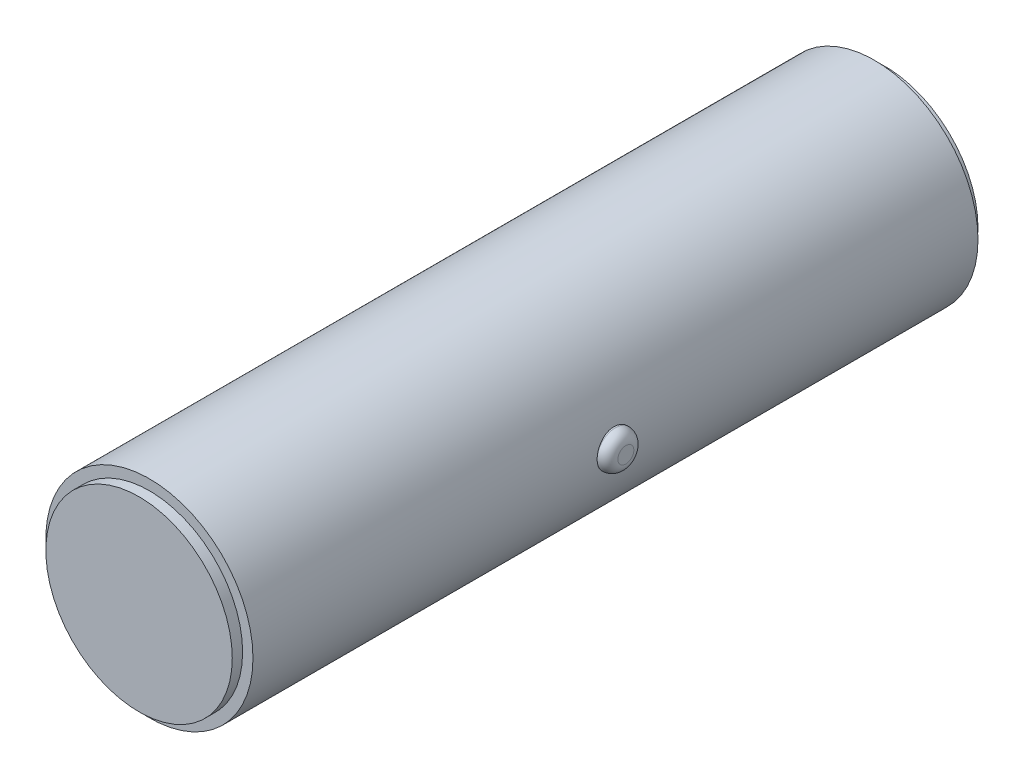
ISO-10303-21;
HEADER;
FILE_DESCRIPTION(('STEP AP214'),'2;1');
FILE_NAME('part.step','',(''),(''),'','','');
FILE_SCHEMA(('AUTOMOTIVE_DESIGN { 1 0 10303 214 1 1 1 1 }'));
ENDSEC;
DATA;
#1=APPLICATION_CONTEXT('core data for automotive mechanical design processes');
#2=APPLICATION_PROTOCOL_DEFINITION('international standard','automotive_design',2000,#1);
#3=PRODUCT_CONTEXT('',#1,'mechanical');
#4=PRODUCT('Part','Part','',(#3));
#5=PRODUCT_RELATED_PRODUCT_CATEGORY('part','',(#4));
#6=PRODUCT_DEFINITION_FORMATION('','',#4);
#7=PRODUCT_DEFINITION_CONTEXT('part definition',#1,'design');
#8=PRODUCT_DEFINITION('design','',#6,#7);
#9=PRODUCT_DEFINITION_SHAPE('','',#8);
#10=(LENGTH_UNIT() NAMED_UNIT(*) SI_UNIT(.MILLI.,.METRE.));
#11=(NAMED_UNIT(*) PLANE_ANGLE_UNIT() SI_UNIT($,.RADIAN.));
#12=(NAMED_UNIT(*) SI_UNIT($,.STERADIAN.) SOLID_ANGLE_UNIT());
#13=UNCERTAINTY_MEASURE_WITH_UNIT(LENGTH_MEASURE(1.E-05),#10,'distance_accuracy_value','');
#14=(GEOMETRIC_REPRESENTATION_CONTEXT(3) GLOBAL_UNCERTAINTY_ASSIGNED_CONTEXT((#13)) GLOBAL_UNIT_ASSIGNED_CONTEXT((#10,
#11,#12)) REPRESENTATION_CONTEXT('',''));
#15=CARTESIAN_POINT('',(0.,0.,0.));
#16=DIRECTION('',(0.,0.,1.));
#17=DIRECTION('',(1.,0.,0.));
#18=AXIS2_PLACEMENT_3D('',#15,#16,#17);
#19=CARTESIAN_POINT('',(2.75,0.,8.75));
#20=DIRECTION('',(-1.,0.,0.));
#21=DIRECTION('',(0.,0.,1.));
#22=AXIS2_PLACEMENT_3D('',#19,#20,#21);
#23=CYLINDRICAL_SURFACE('',#22,0.442588638192356);
#24=CARTESIAN_POINT('',(-2.5,0.,9.19258863819236));
#25=CARTESIAN_POINT('',(-2.49999956404857,0.0246538987312317,9.19258767107046));
#26=CARTESIAN_POINT('',(-2.49963152848147,0.0493206750686057,9.19052170167597));
#27=CARTESIAN_POINT('',(-2.4981988171846,0.0979608192985724,9.18231675618161));
#28=CARTESIAN_POINT('',(-2.49713352631321,0.121933555366402,9.17617418350105));
#29=CARTESIAN_POINT('',(-2.49442563630074,0.168474995137825,9.16000862253972));
#30=CARTESIAN_POINT('',(-2.49278353339188,0.19104488612983,9.14998896896688));
#31=CARTESIAN_POINT('',(-2.48910197304808,0.234180701776339,9.12636276188198));
#32=CARTESIAN_POINT('',(-2.48706255460055,0.254746822758085,9.11275656026109));
#33=CARTESIAN_POINT('',(-2.48278750182822,0.293514485864074,9.0821883318476));
#34=CARTESIAN_POINT('',(-2.4805501704699,0.31169140956903,9.0651953171908));
#35=CARTESIAN_POINT('',(-2.47614424998119,0.344951889927208,9.02840251624654));
#36=CARTESIAN_POINT('',(-2.47397566547945,0.360035238666029,9.00860254145876));
#37=CARTESIAN_POINT('',(-2.46993631710609,0.386780887797342,8.96658638178916));
#38=CARTESIAN_POINT('',(-2.46806774405083,0.398418503855717,8.94435425486531));
#39=CARTESIAN_POINT('',(-2.4648637179868,0.41778440697382,8.89821197084917));
#40=CARTESIAN_POINT('',(-2.46352822419039,0.425512993138221,8.87430194230325));
#41=CARTESIAN_POINT('',(-2.46155855676091,0.436763178824549,8.82574475541856));
#42=CARTESIAN_POINT('',(-2.46091726727485,0.440327494258947,8.80110778813372));
#43=CARTESIAN_POINT('',(-2.46038712905379,0.443280473389301,8.75157779008049));
#44=CARTESIAN_POINT('',(-2.46049822022457,0.442669470576646,8.72668477992135));
#45=CARTESIAN_POINT('',(-2.46145380308909,0.437323874887625,8.67765642937727));
#46=CARTESIAN_POINT('',(-2.46228970983191,0.432637549573002,8.65351563449392));
#47=CARTESIAN_POINT('',(-2.46458727797,0.41935021329997,8.60636842986641));
#48=CARTESIAN_POINT('',(-2.46604896332173,0.410749052470522,8.58336206358877));
#49=CARTESIAN_POINT('',(-2.46944252294821,0.389828105584708,8.5389938679094));
#50=CARTESIAN_POINT('',(-2.47137688673742,0.377488544681365,8.51764156120516));
#51=CARTESIAN_POINT('',(-2.47549616184788,0.349455085484575,8.47729233499266));
#52=CARTESIAN_POINT('',(-2.47768109590844,0.333760882644828,8.45829562958182));
#53=CARTESIAN_POINT('',(-2.48209289598531,0.299201982306836,8.42291770377101));
#54=CARTESIAN_POINT('',(-2.4843199205119,0.280295932863536,8.40657687087044));
#55=CARTESIAN_POINT('',(-2.48853674700884,0.239989147154317,8.37729308078721));
#56=CARTESIAN_POINT('',(-2.49052654706432,0.218588390753972,8.3643501510313));
#57=CARTESIAN_POINT('',(-2.49404810840985,0.173859699145212,8.3422248003006));
#58=CARTESIAN_POINT('',(-2.49557939747955,0.150529808454238,8.33304625269079));
#59=CARTESIAN_POINT('',(-2.49800768610005,0.102626346744371,8.31874930748417));
#60=CARTESIAN_POINT('',(-2.49890474561485,0.0780528935350946,8.31363052604621));
#61=CARTESIAN_POINT('',(-2.49995535395253,0.0287076504891334,8.30765387432255));
#62=CARTESIAN_POINT('',(-2.50011856767823,0.00394276845569906,8.30674061255672));
#63=CARTESIAN_POINT('',(-2.49970967539689,-0.0453859796287312,8.30905281040397));
#64=CARTESIAN_POINT('',(-2.49913760145182,-0.0699498543975787,8.31227808955738));
#65=CARTESIAN_POINT('',(-2.49732841185755,-0.11800599002872,8.32272974933813));
#66=CARTESIAN_POINT('',(-2.4960959047444,-0.141504467385345,8.32992841382763));
#67=CARTESIAN_POINT('',(-2.49310347144785,-0.186961032741709,8.34809273859387));
#68=CARTESIAN_POINT('',(-2.49134351257294,-0.20891902515788,8.35905863237007));
#69=CARTESIAN_POINT('',(-2.48746733169088,-0.250909889560701,8.38457093051854));
#70=CARTESIAN_POINT('',(-2.48534776814401,-0.270921645935817,8.39915157145113));
#71=CARTESIAN_POINT('',(-2.48099681700175,-0.308234172402971,8.43143275146334));
#72=CARTESIAN_POINT('',(-2.47876542018109,-0.325534718356002,8.4491335482332));
#73=CARTESIAN_POINT('',(-2.47441064743343,-0.357141554522845,8.4874021677687));
#74=CARTESIAN_POINT('',(-2.47228885072458,-0.371410233401266,8.50800126329568));
#75=CARTESIAN_POINT('',(-2.46842409123911,-0.396284774835859,8.55133652484501));
#76=CARTESIAN_POINT('',(-2.46668111539278,-0.406890763766094,8.57407261709997));
#77=CARTESIAN_POINT('',(-2.4637834585941,-0.424084014094575,8.62093600179494));
#78=CARTESIAN_POINT('',(-2.46262614616001,-0.430689278260196,8.64505651919045));
#79=CARTESIAN_POINT('',(-2.46102452760632,-0.439749716929646,8.69408712778733));
#80=CARTESIAN_POINT('',(-2.46058015067981,-0.442205303570015,8.71899714032745));
#81=CARTESIAN_POINT('',(-2.4604580328741,-0.442884069605334,8.76852351937976));
#82=CARTESIAN_POINT('',(-2.46076955812457,-0.441166507576265,8.79313906707716));
#83=CARTESIAN_POINT('',(-2.46210048534262,-0.433676642055186,8.8417248427398));
#84=CARTESIAN_POINT('',(-2.46311988412567,-0.427904356804321,8.86569507360764));
#85=CARTESIAN_POINT('',(-2.46574740344144,-0.412492729806605,8.91228253073756));
#86=CARTESIAN_POINT('',(-2.46735464974031,-0.402859128494353,8.93490170844301));
#87=CARTESIAN_POINT('',(-2.47097749676932,-0.380004596203761,8.97821231842151));
#88=CARTESIAN_POINT('',(-2.47299312196013,-0.366783450326185,8.99890363511306));
#89=CARTESIAN_POINT('',(-2.47723930600876,-0.336920274484989,9.03806934856259));
#90=CARTESIAN_POINT('',(-2.47947237827536,-0.320234869670835,9.05651040548106));
#91=CARTESIAN_POINT('',(-2.48388240918825,-0.284007841041004,9.09035090669596));
#92=CARTESIAN_POINT('',(-2.48605935480512,-0.26446556092022,9.10574965017034));
#93=CARTESIAN_POINT('',(-2.49013190764364,-0.222895229610773,9.13318086813669));
#94=CARTESIAN_POINT('',(-2.49202515670085,-0.200848762340088,9.14518579117811));
#95=CARTESIAN_POINT('',(-2.49529404248833,-0.155026510273439,9.16530270521884));
#96=CARTESIAN_POINT('',(-2.49667018035612,-0.131252426537849,9.1734184673531));
#97=CARTESIAN_POINT('',(-2.49845897269763,-0.0894970678064167,9.1838197846304));
#98=CARTESIAN_POINT('',(-2.49903368537166,-0.0717644669764648,9.18710266965736));
#99=CARTESIAN_POINT('',(-2.49980435433586,-0.0360235322755624,9.1914874269439));
#100=CARTESIAN_POINT('',(-2.50000031856032,-0.0180152041887029,9.19258934489188));
#101=CARTESIAN_POINT('',(-2.5,0.,9.19258863819236));
#102=B_SPLINE_CURVE_WITH_KNOTS('',3,(#24,#25,#26,#27,#28,#29,#30,#31,#32,#33,#34,#35,#36,#37,
#38,#39,#40,#41,#42,#43,#44,#45,#46,#47,#48,#49,#50,#51,#52,#53,#54,#55,#56,#57,#58,#59,#60,#61,
#62,#63,#64,#65,#66,#67,#68,#69,#70,#71,#72,#73,#74,#75,#76,#77,#78,#79,#80,#81,#82,#83,#84,#85,
#86,#87,#88,#89,#90,#91,#92,#93,#94,#95,#96,#97,#98,#99,#100,#101),.UNSPECIFIED.,.T.,.F.,(4,2,2,
2,2,2,2,2,2,2,2,2,2,2,2,2,2,2,2,2,2,2,2,2,2,2,2,2,2,2,2,2,2,2,2,2,2,2,4),(0.,0.0738958301986517,
0.147856941768509,0.221754579699196,0.295644969921838,0.370245326099432,0.444850694410136,
0.51997825740343,0.595100071040326,0.6694443459476,0.743782682891755,0.817252376620235,
0.890724883214123,0.964593028486895,1.03846788262239,1.11337809611953,1.18828891424824,
1.26327661972141,1.33825723444132,1.41224738991394,1.48623431918075,1.55971156193902,
1.6331933597674,1.70739966247237,1.78161209666852,1.85669740576632,1.93178012393124,
2.00652241923958,2.08125729087665,2.15493714727741,2.22861667221375,2.30218706519282,
2.37576186612072,2.45032038615601,2.52489606138802,2.60006082020025,2.67515254708961,
2.72915116098171,2.78314864366123),.UNSPECIFIED.);
#103=CARTESIAN_POINT('',(-2.5,0.,9.19258863819236));
#104=VERTEX_POINT('',#103);
#105=CARTESIAN_POINT('',(-2.50000000000172,1.22308973471287E-12,8.30741136179792));
#106=VERTEX_POINT('',#105);
#107=EDGE_CURVE('E86',#104,#106,#102,.T.);
#108=ORIENTED_EDGE('',*,*,#107,.T.);
#109=CARTESIAN_POINT('',(-2.5,0.,8.75));
#110=DIRECTION('',(1.,0.,0.));
#111=DIRECTION('',(0.,0.,-1.));
#112=AXIS2_PLACEMENT_3D('',#109,#110,#111);
#113=CIRCLE('',#112,0.442588638192356);
#114=EDGE_CURVE('E43',#106,#104,#113,.T.);
#115=ORIENTED_EDGE('',*,*,#114,.T.);
#116=EDGE_LOOP('',(#108,#115));
#117=FACE_BOUND('',#116,.T.);
#118=ADVANCED_FACE('F35',(#117),#23,.T.);
#119=CARTESIAN_POINT('',(2.5,0.,9.19258863819236));
#120=CARTESIAN_POINT('',(2.49999956404857,-0.0246538987312317,9.19258767107046));
#121=CARTESIAN_POINT('',(2.49963152848147,-0.0493206750686057,9.19052170167597));
#122=CARTESIAN_POINT('',(2.4981988171846,-0.0979608192985724,9.18231675618161));
#123=CARTESIAN_POINT('',(2.49713352631321,-0.121933555366402,9.17617418350105));
#124=CARTESIAN_POINT('',(2.49442563630074,-0.168474995137825,9.16000862253972));
#125=CARTESIAN_POINT('',(2.49278353339188,-0.19104488612983,9.14998896896688));
#126=CARTESIAN_POINT('',(2.48910197304808,-0.234180701776339,9.12636276188198));
#127=CARTESIAN_POINT('',(2.48706255460055,-0.254746822758085,9.11275656026109));
#128=CARTESIAN_POINT('',(2.48278750182822,-0.293514485864074,9.0821883318476));
#129=CARTESIAN_POINT('',(2.4805501704699,-0.31169140956903,9.0651953171908));
#130=CARTESIAN_POINT('',(2.47614424998119,-0.344951889927208,9.02840251624654));
#131=CARTESIAN_POINT('',(2.47397566547945,-0.360035238666029,9.00860254145876));
#132=CARTESIAN_POINT('',(2.46993631710609,-0.386780887797342,8.96658638178916));
#133=CARTESIAN_POINT('',(2.46806774405083,-0.398418503855717,8.94435425486531));
#134=CARTESIAN_POINT('',(2.4648637179868,-0.41778440697382,8.89821197084917));
#135=CARTESIAN_POINT('',(2.46352822419039,-0.425512993138221,8.87430194230325));
#136=CARTESIAN_POINT('',(2.46155855676091,-0.436763178824549,8.82574475541856));
#137=CARTESIAN_POINT('',(2.46091726727485,-0.440327494258947,8.80110778813372));
#138=CARTESIAN_POINT('',(2.46038712905379,-0.443280473389301,8.75157779008049));
#139=CARTESIAN_POINT('',(2.46049822022457,-0.442669470576646,8.72668477992135));
#140=CARTESIAN_POINT('',(2.46145380308909,-0.437323874887625,8.67765642937727));
#141=CARTESIAN_POINT('',(2.46228970983191,-0.432637549573002,8.65351563449392));
#142=CARTESIAN_POINT('',(2.46458727797,-0.41935021329997,8.60636842986641));
#143=CARTESIAN_POINT('',(2.46604896332173,-0.410749052470522,8.58336206358877));
#144=CARTESIAN_POINT('',(2.46944252294821,-0.389828105584708,8.5389938679094));
#145=CARTESIAN_POINT('',(2.47137688673742,-0.377488544681365,8.51764156120516));
#146=CARTESIAN_POINT('',(2.47549616184788,-0.349455085484575,8.47729233499266));
#147=CARTESIAN_POINT('',(2.47768109590844,-0.333760882644828,8.45829562958182));
#148=CARTESIAN_POINT('',(2.48209289598531,-0.299201982306836,8.42291770377101));
#149=CARTESIAN_POINT('',(2.4843199205119,-0.280295932863536,8.40657687087044));
#150=CARTESIAN_POINT('',(2.48853674700884,-0.239989147154317,8.37729308078721));
#151=CARTESIAN_POINT('',(2.49052654706432,-0.218588390753972,8.3643501510313));
#152=CARTESIAN_POINT('',(2.49404810840985,-0.173859699145212,8.3422248003006));
#153=CARTESIAN_POINT('',(2.49557939747955,-0.150529808454238,8.33304625269079));
#154=CARTESIAN_POINT('',(2.49800768610005,-0.102626346744371,8.31874930748417));
#155=CARTESIAN_POINT('',(2.49890474561485,-0.0780528935350946,8.31363052604621));
#156=CARTESIAN_POINT('',(2.49995535395253,-0.0287076504891334,8.30765387432255));
#157=CARTESIAN_POINT('',(2.50011856767823,-0.00394276845569906,8.30674061255672));
#158=CARTESIAN_POINT('',(2.49970967539689,0.0453859796287312,8.30905281040397));
#159=CARTESIAN_POINT('',(2.49913760145182,0.0699498543975787,8.31227808955738));
#160=CARTESIAN_POINT('',(2.49732841185755,0.11800599002872,8.32272974933813));
#161=CARTESIAN_POINT('',(2.4960959047444,0.141504467385345,8.32992841382763));
#162=CARTESIAN_POINT('',(2.49310347144785,0.186961032741709,8.34809273859387));
#163=CARTESIAN_POINT('',(2.49134351257294,0.20891902515788,8.35905863237007));
#164=CARTESIAN_POINT('',(2.48746733169088,0.250909889560701,8.38457093051854));
#165=CARTESIAN_POINT('',(2.48534776814401,0.270921645935817,8.39915157145113));
#166=CARTESIAN_POINT('',(2.48099681700175,0.308234172402971,8.43143275146334));
#167=CARTESIAN_POINT('',(2.47876542018109,0.325534718356002,8.4491335482332));
#168=CARTESIAN_POINT('',(2.47441064743343,0.357141554522845,8.4874021677687));
#169=CARTESIAN_POINT('',(2.47228885072458,0.371410233401266,8.50800126329568));
#170=CARTESIAN_POINT('',(2.46842409123911,0.396284774835859,8.55133652484501));
#171=CARTESIAN_POINT('',(2.46668111539278,0.406890763766094,8.57407261709997));
#172=CARTESIAN_POINT('',(2.4637834585941,0.424084014094575,8.62093600179494));
#173=CARTESIAN_POINT('',(2.46262614616001,0.430689278260196,8.64505651919045));
#174=CARTESIAN_POINT('',(2.46102452760632,0.439749716929646,8.69408712778733));
#175=CARTESIAN_POINT('',(2.46058015067981,0.442205303570015,8.71899714032745));
#176=CARTESIAN_POINT('',(2.4604580328741,0.442884069605334,8.76852351937976));
#177=CARTESIAN_POINT('',(2.46076955812457,0.441166507576265,8.79313906707716));
#178=CARTESIAN_POINT('',(2.46210048534262,0.433676642055186,8.8417248427398));
#179=CARTESIAN_POINT('',(2.46311988412567,0.427904356804321,8.86569507360764));
#180=CARTESIAN_POINT('',(2.46574740344144,0.412492729806605,8.91228253073756));
#181=CARTESIAN_POINT('',(2.46735464974031,0.402859128494353,8.93490170844301));
#182=CARTESIAN_POINT('',(2.47097749676932,0.380004596203761,8.97821231842151));
#183=CARTESIAN_POINT('',(2.47299312196013,0.366783450326185,8.99890363511306));
#184=CARTESIAN_POINT('',(2.47723930600876,0.336920274484989,9.03806934856259));
#185=CARTESIAN_POINT('',(2.47947237827536,0.320234869670835,9.05651040548106));
#186=CARTESIAN_POINT('',(2.48388240918825,0.284007841041004,9.09035090669596));
#187=CARTESIAN_POINT('',(2.48605935480512,0.26446556092022,9.10574965017034));
#188=CARTESIAN_POINT('',(2.49013190764364,0.222895229610773,9.13318086813669));
#189=CARTESIAN_POINT('',(2.49202515670085,0.200848762340088,9.14518579117811));
#190=CARTESIAN_POINT('',(2.49529404248833,0.155026510273439,9.16530270521884));
#191=CARTESIAN_POINT('',(2.49667018035612,0.131252426537849,9.1734184673531));
#192=CARTESIAN_POINT('',(2.49845897269763,0.0894970678064167,9.1838197846304));
#193=CARTESIAN_POINT('',(2.49903368537166,0.0717644669764648,9.18710266965736));
#194=CARTESIAN_POINT('',(2.49980435433586,0.0360235322755624,9.1914874269439));
#195=CARTESIAN_POINT('',(2.50000031856032,0.0180152041887029,9.19258934489188));
#196=CARTESIAN_POINT('',(2.5,0.,9.19258863819236));
#197=B_SPLINE_CURVE_WITH_KNOTS('',3,(#119,#120,#121,#122,#123,#124,#125,#126,#127,#128,#129,
#130,#131,#132,#133,#134,#135,#136,#137,#138,#139,#140,#141,#142,#143,#144,#145,#146,#147,#148,
#149,#150,#151,#152,#153,#154,#155,#156,#157,#158,#159,#160,#161,#162,#163,#164,#165,#166,#167,
#168,#169,#170,#171,#172,#173,#174,#175,#176,#177,#178,#179,#180,#181,#182,#183,#184,#185,#186,
#187,#188,#189,#190,#191,#192,#193,#194,#195,#196),.UNSPECIFIED.,.T.,.F.,(4,2,2,2,2,2,2,2,2,2,2,
2,2,2,2,2,2,2,2,2,2,2,2,2,2,2,2,2,2,2,2,2,2,2,2,2,2,2,4),(0.,0.0738958301986517,
0.147856941768509,0.221754579699196,0.295644969921838,0.370245326099432,0.444850694410136,
0.51997825740343,0.595100071040326,0.6694443459476,0.743782682891755,0.817252376620235,
0.890724883214123,0.964593028486895,1.03846788262239,1.11337809611953,1.18828891424824,
1.26327661972141,1.33825723444132,1.41224738991394,1.48623431918075,1.55971156193902,
1.6331933597674,1.70739966247237,1.78161209666852,1.85669740576632,1.93178012393124,
2.00652241923958,2.08125729087665,2.15493714727741,2.22861667221375,2.30218706519282,
2.37576186612072,2.45032038615601,2.52489606138802,2.60006082020025,2.67515254708961,
2.72915116098171,2.78314864366123),.UNSPECIFIED.);
#198=CARTESIAN_POINT('',(2.5,0.,9.19258863819236));
#199=VERTEX_POINT('',#198);
#200=CARTESIAN_POINT('',(2.50000000000172,-1.22308973471287E-12,8.30741136179792));
#201=VERTEX_POINT('',#200);
#202=EDGE_CURVE('E76',#199,#201,#197,.T.);
#203=ORIENTED_EDGE('',*,*,#202,.T.);
#204=CARTESIAN_POINT('',(2.5,0.,8.75));
#205=DIRECTION('',(1.,0.,0.));
#206=DIRECTION('',(0.,0.,-1.));
#207=AXIS2_PLACEMENT_3D('',#204,#205,#206);
#208=CIRCLE('',#207,0.442588638192356);
#209=EDGE_CURVE('E66',#201,#199,#208,.F.);
#210=ORIENTED_EDGE('',*,*,#209,.T.);
#211=EDGE_LOOP('',(#203,#210));
#212=FACE_BOUND('',#211,.T.);
#213=ADVANCED_FACE('F74',(#212),#23,.T.);
#214=CARTESIAN_POINT('',(0.,0.,17.5));
#215=DIRECTION('',(0.,0.,-1.));
#216=DIRECTION('',(-1.,0.,0.));
#217=AXIS2_PLACEMENT_3D('',#214,#215,#216);
#218=CYLINDRICAL_SURFACE('',#217,2.5);
#219=ORIENTED_EDGE('',*,*,#202,.F.);
#220=EDGE_CURVE('E78',#201,#199,#197,.T.);
#221=ORIENTED_EDGE('',*,*,#220,.F.);
#222=EDGE_LOOP('',(#219,#221));
#223=FACE_BOUND('',#222,.T.);
#224=CARTESIAN_POINT('',(0.,0.,17.5));
#225=DIRECTION('',(0.,0.,1.));
#226=DIRECTION('',(1.,0.,0.));
#227=AXIS2_PLACEMENT_3D('',#224,#225,#226);
#228=CIRCLE('',#227,2.5);
#229=CARTESIAN_POINT('',(2.5,0.,17.5));
#230=VERTEX_POINT('',#229);
#231=EDGE_CURVE('E272',#230,#230,#228,.T.);
#232=ORIENTED_EDGE('',*,*,#231,.F.);
#233=EDGE_LOOP('',(#232));
#234=FACE_BOUND('',#233,.T.);
#235=CARTESIAN_POINT('',(0.,0.,0.));
#236=DIRECTION('',(0.,0.,1.));
#237=DIRECTION('',(1.,0.,0.));
#238=AXIS2_PLACEMENT_3D('',#235,#236,#237);
#239=CIRCLE('',#238,2.5);
#240=CARTESIAN_POINT('',(2.5,0.,0.));
#241=VERTEX_POINT('',#240);
#242=EDGE_CURVE('E268',#241,#241,#239,.T.);
#243=ORIENTED_EDGE('',*,*,#242,.T.);
#244=EDGE_LOOP('',(#243));
#245=FACE_BOUND('',#244,.T.);
#246=ORIENTED_EDGE('',*,*,#107,.F.);
#247=EDGE_CURVE('E85',#106,#104,#102,.T.);
#248=ORIENTED_EDGE('',*,*,#247,.F.);
#249=EDGE_LOOP('',(#246,#248));
#250=FACE_BOUND('',#249,.T.);
#251=ADVANCED_FACE('F83',(#223,#234,#245,#250),#218,.T.);
#252=CARTESIAN_POINT('',(0.,0.,-0.25));
#253=DIRECTION('',(0.,0.,-1.));
#254=DIRECTION('',(-1.,0.,0.));
#255=AXIS2_PLACEMENT_3D('',#252,#253,#254);
#256=PLANE('',#255);
#257=CARTESIAN_POINT('',(0.,0.,-0.25));
#258=DIRECTION('',(0.,0.,-1.));
#259=DIRECTION('',(-1.,0.,0.));
#260=AXIS2_PLACEMENT_3D('',#257,#258,#259);
#261=CIRCLE('',#260,2.25);
#262=CARTESIAN_POINT('',(-2.25,0.,-0.25));
#263=VERTEX_POINT('',#262);
#264=EDGE_CURVE('E281',#263,#263,#261,.T.);
#265=ORIENTED_EDGE('',*,*,#264,.T.);
#266=EDGE_LOOP('',(#265));
#267=FACE_BOUND('',#266,.T.);
#268=CARTESIAN_POINT('',(0.,0.,-0.25));
#269=DIRECTION('',(0.,0.,-1.));
#270=DIRECTION('',(-1.,0.,0.));
#271=AXIS2_PLACEMENT_3D('',#268,#269,#270);
#272=CIRCLE('',#271,0.25);
#273=CARTESIAN_POINT('',(-0.25,0.,-0.25));
#274=VERTEX_POINT('',#273);
#275=EDGE_CURVE('E287',#274,#274,#272,.T.);
#276=ORIENTED_EDGE('',*,*,#275,.F.);
#277=EDGE_LOOP('',(#276));
#278=FACE_BOUND('',#277,.T.);
#279=ADVANCED_FACE('F117',(#267,#278),#256,.T.);
#280=CARTESIAN_POINT('',(0.,0.,0.));
#281=DIRECTION('',(0.,0.,1.));
#282=DIRECTION('',(1.,0.,0.));
#283=AXIS2_PLACEMENT_3D('',#280,#281,#282);
#284=PLANE('',#283);
#285=ORIENTED_EDGE('',*,*,#242,.F.);
#286=EDGE_LOOP('',(#285));
#287=FACE_BOUND('',#286,.T.);
#288=CARTESIAN_POINT('',(0.,0.,0.));
#289=DIRECTION('',(0.,0.,1.));
#290=DIRECTION('',(1.,0.,0.));
#291=AXIS2_PLACEMENT_3D('',#288,#289,#290);
#292=CIRCLE('',#291,2.25);
#293=CARTESIAN_POINT('',(2.25,0.,0.));
#294=VERTEX_POINT('',#293);
#295=EDGE_CURVE('E81',#294,#294,#292,.F.);
#296=ORIENTED_EDGE('',*,*,#295,.F.);
#297=EDGE_LOOP('',(#296));
#298=FACE_BOUND('',#297,.T.);
#299=ADVANCED_FACE('F120',(#287,#298),#284,.F.);
#300=CARTESIAN_POINT('',(0.,0.,17.5));
#301=DIRECTION('',(0.,0.,1.));
#302=DIRECTION('',(1.,0.,0.));
#303=AXIS2_PLACEMENT_3D('',#300,#301,#302);
#304=PLANE('',#303);
#305=ORIENTED_EDGE('',*,*,#231,.T.);
#306=EDGE_LOOP('',(#305));
#307=FACE_BOUND('',#306,.T.);
#308=CARTESIAN_POINT('',(0.,0.,17.5));
#309=DIRECTION('',(0.,0.,1.));
#310=DIRECTION('',(1.,0.,0.));
#311=AXIS2_PLACEMENT_3D('',#308,#309,#310);
#312=CIRCLE('',#311,2.25);
#313=CARTESIAN_POINT('',(2.25,0.,17.5));
#314=VERTEX_POINT('',#313);
#315=EDGE_CURVE('E278',#314,#314,#312,.T.);
#316=ORIENTED_EDGE('',*,*,#315,.F.);
#317=EDGE_LOOP('',(#316));
#318=FACE_BOUND('',#317,.T.);
#319=ADVANCED_FACE('F132',(#307,#318),#304,.T.);
#320=CARTESIAN_POINT('',(0.,0.,17.75));
#321=DIRECTION('',(0.,0.,-1.));
#322=DIRECTION('',(-1.,0.,0.));
#323=AXIS2_PLACEMENT_3D('',#320,#321,#322);
#324=CYLINDRICAL_SURFACE('',#323,2.25);
#325=CARTESIAN_POINT('',(0.,0.,17.75));
#326=DIRECTION('',(0.,0.,1.));
#327=DIRECTION('',(1.,0.,0.));
#328=AXIS2_PLACEMENT_3D('',#325,#326,#327);
#329=CIRCLE('',#328,2.25);
#330=CARTESIAN_POINT('',(2.25,0.,17.75));
#331=VERTEX_POINT('',#330);
#332=EDGE_CURVE('E276',#331,#331,#329,.T.);
#333=ORIENTED_EDGE('',*,*,#332,.F.);
#334=EDGE_LOOP('',(#333));
#335=FACE_BOUND('',#334,.T.);
#336=ORIENTED_EDGE('',*,*,#315,.T.);
#337=EDGE_LOOP('',(#336));
#338=FACE_BOUND('',#337,.T.);
#339=ADVANCED_FACE('F128',(#335,#338),#324,.T.);
#340=CARTESIAN_POINT('',(0.,0.,17.75));
#341=DIRECTION('',(0.,0.,1.));
#342=DIRECTION('',(1.,0.,0.));
#343=AXIS2_PLACEMENT_3D('',#340,#341,#342);
#344=PLANE('',#343);
#345=ORIENTED_EDGE('',*,*,#332,.T.);
#346=EDGE_LOOP('',(#345));
#347=FACE_BOUND('',#346,.T.);
#348=ADVANCED_FACE('F124',(#347),#344,.T.);
#349=CARTESIAN_POINT('',(0.,0.,-0.25));
#350=DIRECTION('',(0.,0.,1.));
#351=DIRECTION('',(1.,0.,0.));
#352=AXIS2_PLACEMENT_3D('',#349,#350,#351);
#353=CYLINDRICAL_SURFACE('',#352,2.25);
#354=ORIENTED_EDGE('',*,*,#264,.F.);
#355=EDGE_LOOP('',(#354));
#356=FACE_BOUND('',#355,.T.);
#357=ORIENTED_EDGE('',*,*,#295,.T.);
#358=EDGE_LOOP('',(#357));
#359=FACE_BOUND('',#358,.T.);
#360=ADVANCED_FACE('F115',(#356,#359),#353,.T.);
#361=CARTESIAN_POINT('',(0.,0.,-1.25));
#362=DIRECTION('',(0.,0.,1.));
#363=DIRECTION('',(1.,0.,0.));
#364=AXIS2_PLACEMENT_3D('',#361,#362,#363);
#365=CYLINDRICAL_SURFACE('',#364,0.25);
#366=CARTESIAN_POINT('',(0.,0.,-1.25));
#367=DIRECTION('',(0.,0.,-1.));
#368=DIRECTION('',(-1.,0.,0.));
#369=AXIS2_PLACEMENT_3D('',#366,#367,#368);
#370=CIRCLE('',#369,0.25);
#371=CARTESIAN_POINT('',(-0.25,0.,-1.25));
#372=VERTEX_POINT('',#371);
#373=EDGE_CURVE('E286',#372,#372,#370,.T.);
#374=ORIENTED_EDGE('',*,*,#373,.F.);
#375=EDGE_LOOP('',(#374));
#376=FACE_BOUND('',#375,.T.);
#377=ORIENTED_EDGE('',*,*,#275,.T.);
#378=EDGE_LOOP('',(#377));
#379=FACE_BOUND('',#378,.T.);
#380=ADVANCED_FACE('F111',(#376,#379),#365,.T.);
#381=CARTESIAN_POINT('',(0.,0.,-1.25));
#382=DIRECTION('',(0.,0.,-1.));
#383=DIRECTION('',(-1.,0.,0.));
#384=AXIS2_PLACEMENT_3D('',#381,#382,#383);
#385=PLANE('',#384);
#386=ORIENTED_EDGE('',*,*,#373,.T.);
#387=EDGE_LOOP('',(#386));
#388=FACE_BOUND('',#387,.T.);
#389=ADVANCED_FACE('F107',(#388),#385,.T.);
#390=CARTESIAN_POINT('',(2.75,0.,8.75));
#391=DIRECTION('',(1.,0.,0.));
#392=DIRECTION('',(0.,0.,-1.));
#393=AXIS2_PLACEMENT_3D('',#390,#391,#392);
#394=PLANE('',#393);
#395=CARTESIAN_POINT('',(2.75,0.,8.75));
#396=DIRECTION('',(1.,0.,0.));
#397=DIRECTION('',(0.,0.,-1.));
#398=AXIS2_PLACEMENT_3D('',#395,#396,#397);
#399=CIRCLE('',#398,0.192588638192356);
#400=CARTESIAN_POINT('',(2.75,0.,8.55741136180765));
#401=VERTEX_POINT('',#400);
#402=EDGE_CURVE('E70',#401,#401,#399,.T.);
#403=ORIENTED_EDGE('',*,*,#402,.T.);
#404=EDGE_LOOP('',(#403));
#405=FACE_BOUND('',#404,.T.);
#406=ADVANCED_FACE('F105',(#405),#394,.T.);
#407=ORIENTED_EDGE('',*,*,#220,.T.);
#408=CARTESIAN_POINT('',(2.5,0.,8.75));
#409=DIRECTION('',(1.,0.,0.));
#410=DIRECTION('',(0.,0.,-1.));
#411=AXIS2_PLACEMENT_3D('',#408,#409,#410);
#412=CIRCLE('',#411,0.442588638192356);
#413=EDGE_CURVE('E62',#199,#201,#412,.F.);
#414=ORIENTED_EDGE('',*,*,#413,.T.);
#415=EDGE_LOOP('',(#407,#414));
#416=FACE_BOUND('',#415,.T.);
#417=ADVANCED_FACE('F79',(#416),#23,.T.);
#418=ORIENTED_EDGE('',*,*,#247,.T.);
#419=CARTESIAN_POINT('',(-2.5,0.,8.75));
#420=DIRECTION('',(1.,0.,0.));
#421=DIRECTION('',(0.,0.,-1.));
#422=AXIS2_PLACEMENT_3D('',#419,#420,#421);
#423=CIRCLE('',#422,0.442588638192356);
#424=EDGE_CURVE('E49',#104,#106,#423,.T.);
#425=ORIENTED_EDGE('',*,*,#424,.T.);
#426=EDGE_LOOP('',(#418,#425));
#427=FACE_BOUND('',#426,.T.);
#428=ADVANCED_FACE('F99',(#427),#23,.T.);
#429=CARTESIAN_POINT('',(-2.75,0.,8.75));
#430=DIRECTION('',(1.,0.,0.));
#431=DIRECTION('',(0.,0.,-1.));
#432=AXIS2_PLACEMENT_3D('',#429,#430,#431);
#433=PLANE('',#432);
#434=CARTESIAN_POINT('',(-2.75,0.,8.75));
#435=DIRECTION('',(1.,0.,0.));
#436=DIRECTION('',(0.,0.,-1.));
#437=AXIS2_PLACEMENT_3D('',#434,#435,#436);
#438=CIRCLE('',#437,0.192588638192356);
#439=CARTESIAN_POINT('',(-2.75,0.,8.55741136180765));
#440=VERTEX_POINT('',#439);
#441=EDGE_CURVE('E11',#440,#440,#438,.F.);
#442=ORIENTED_EDGE('',*,*,#441,.T.);
#443=EDGE_LOOP('',(#442));
#444=FACE_BOUND('',#443,.T.);
#445=ADVANCED_FACE('F104',(#444),#433,.F.);
#446=CARTESIAN_POINT('',(2.5,0.,8.75));
#447=DIRECTION('',(1.,0.,0.));
#448=DIRECTION('',(0.,0.,-1.));
#449=AXIS2_PLACEMENT_3D('',#446,#447,#448);
#450=DEGENERATE_TOROIDAL_SURFACE('',#449,0.192588638192356,0.25,.T.);
#451=ORIENTED_EDGE('',*,*,#413,.F.);
#452=ORIENTED_EDGE('',*,*,#209,.F.);
#453=EDGE_LOOP('',(#451,#452));
#454=FACE_BOUND('',#453,.T.);
#455=ORIENTED_EDGE('',*,*,#402,.F.);
#456=EDGE_LOOP('',(#455));
#457=FACE_BOUND('',#456,.T.);
#458=ADVANCED_FACE('F64',(#454,#457),#450,.T.);
#459=CARTESIAN_POINT('',(-2.5,0.,8.75));
#460=DIRECTION('',(1.,0.,0.));
#461=DIRECTION('',(0.,0.,-1.));
#462=AXIS2_PLACEMENT_3D('',#459,#460,#461);
#463=DEGENERATE_TOROIDAL_SURFACE('',#462,0.192588638192356,0.25,.T.);
#464=ORIENTED_EDGE('',*,*,#441,.F.);
#465=EDGE_LOOP('',(#464));
#466=FACE_BOUND('',#465,.T.);
#467=ORIENTED_EDGE('',*,*,#424,.F.);
#468=ORIENTED_EDGE('',*,*,#114,.F.);
#469=EDGE_LOOP('',(#467,#468));
#470=FACE_BOUND('',#469,.T.);
#471=ADVANCED_FACE('F37',(#466,#470),#463,.T.);
#472=CLOSED_SHELL('',(#118,#213,#251,#279,#299,#319,#339,#348,#360,#380,#389,#406,#417,#428,
#445,#458,#471));
#473=MANIFOLD_SOLID_BREP('B2',#472);
#474=ADVANCED_BREP_SHAPE_REPRESENTATION('',(#18,#473),#14);
#475=SHAPE_DEFINITION_REPRESENTATION(#9,#474);
ENDSEC;
END-ISO-10303-21;
